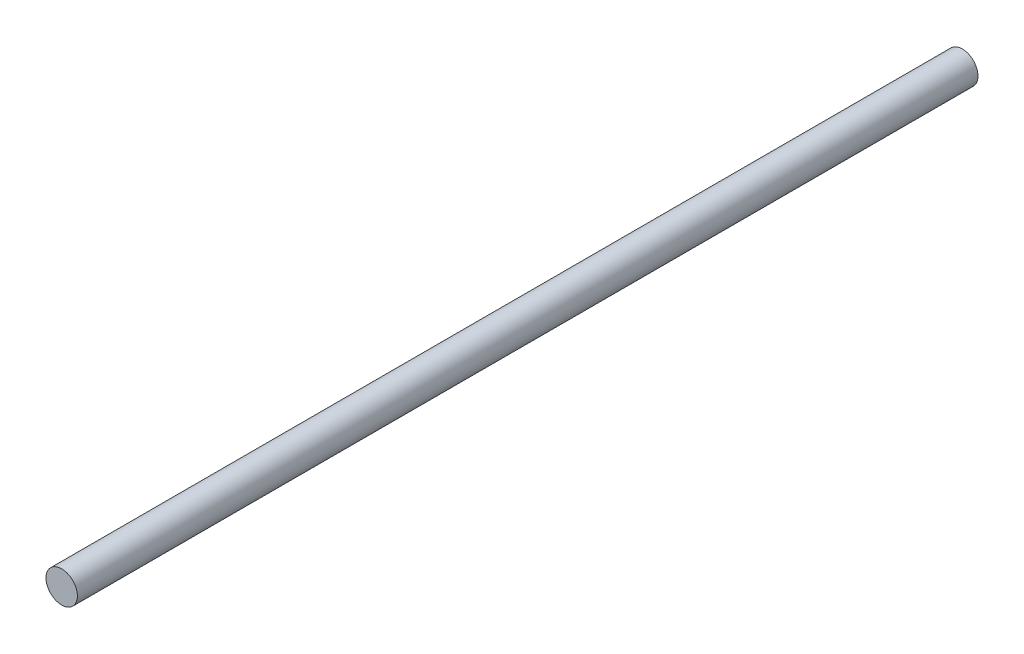
ISO-10303-21;
HEADER;
FILE_DESCRIPTION(('STEP AP214'),'2;1');
FILE_NAME('part.step','',(''),(''),'','','');
FILE_SCHEMA(('AUTOMOTIVE_DESIGN { 1 0 10303 214 1 1 1 1 }'));
ENDSEC;
DATA;
#1=APPLICATION_CONTEXT('core data for automotive mechanical design processes');
#2=APPLICATION_PROTOCOL_DEFINITION('international standard','automotive_design',2000,#1);
#3=PRODUCT_CONTEXT('',#1,'mechanical');
#4=PRODUCT('Part','Part','',(#3));
#5=PRODUCT_RELATED_PRODUCT_CATEGORY('part','',(#4));
#6=PRODUCT_DEFINITION_FORMATION('','',#4);
#7=PRODUCT_DEFINITION_CONTEXT('part definition',#1,'design');
#8=PRODUCT_DEFINITION('design','',#6,#7);
#9=PRODUCT_DEFINITION_SHAPE('','',#8);
#10=(LENGTH_UNIT() NAMED_UNIT(*) SI_UNIT(.MILLI.,.METRE.));
#11=(NAMED_UNIT(*) PLANE_ANGLE_UNIT() SI_UNIT($,.RADIAN.));
#12=(NAMED_UNIT(*) SI_UNIT($,.STERADIAN.) SOLID_ANGLE_UNIT());
#13=UNCERTAINTY_MEASURE_WITH_UNIT(LENGTH_MEASURE(1.E-05),#10,'distance_accuracy_value','');
#14=(GEOMETRIC_REPRESENTATION_CONTEXT(3) GLOBAL_UNCERTAINTY_ASSIGNED_CONTEXT((#13)) GLOBAL_UNIT_ASSIGNED_CONTEXT((#10,
#11,#12)) REPRESENTATION_CONTEXT('',''));
#15=CARTESIAN_POINT('',(0.,0.,0.));
#16=DIRECTION('',(0.,0.,1.));
#17=DIRECTION('',(1.,0.,0.));
#18=AXIS2_PLACEMENT_3D('',#15,#16,#17);
#19=CARTESIAN_POINT('',(0.,0.,91.));
#20=DIRECTION('',(0.,0.,-1.));
#21=DIRECTION('',(-1.,0.,0.));
#22=AXIS2_PLACEMENT_3D('',#19,#20,#21);
#23=CYLINDRICAL_SURFACE('',#22,3.175);
#24=CARTESIAN_POINT('',(0.,0.,91.));
#25=DIRECTION('',(0.,0.,1.));
#26=DIRECTION('',(1.,0.,0.));
#27=AXIS2_PLACEMENT_3D('',#24,#25,#26);
#28=CIRCLE('',#27,3.175);
#29=CARTESIAN_POINT('',(3.175,0.,91.));
#30=VERTEX_POINT('',#29);
#31=EDGE_CURVE('E10',#30,#30,#28,.T.);
#32=ORIENTED_EDGE('',*,*,#31,.F.);
#33=EDGE_LOOP('',(#32));
#34=FACE_BOUND('',#33,.T.);
#35=CARTESIAN_POINT('',(0.,0.,-91.));
#36=DIRECTION('',(0.,0.,1.));
#37=DIRECTION('',(1.,0.,0.));
#38=AXIS2_PLACEMENT_3D('',#35,#36,#37);
#39=CIRCLE('',#38,3.175);
#40=CARTESIAN_POINT('',(3.175,0.,-91.));
#41=VERTEX_POINT('',#40);
#42=EDGE_CURVE('E45',#41,#41,#39,.T.);
#43=ORIENTED_EDGE('',*,*,#42,.T.);
#44=EDGE_LOOP('',(#43));
#45=FACE_BOUND('',#44,.T.);
#46=ADVANCED_FACE('F39',(#34,#45),#23,.T.);
#47=CARTESIAN_POINT('',(0.,0.,91.));
#48=DIRECTION('',(0.,0.,1.));
#49=DIRECTION('',(1.,0.,0.));
#50=AXIS2_PLACEMENT_3D('',#47,#48,#49);
#51=PLANE('',#50);
#52=ORIENTED_EDGE('',*,*,#31,.T.);
#53=EDGE_LOOP('',(#52));
#54=FACE_BOUND('',#53,.T.);
#55=ADVANCED_FACE('F53',(#54),#51,.T.);
#56=CARTESIAN_POINT('',(0.,0.,-91.));
#57=DIRECTION('',(0.,0.,1.));
#58=DIRECTION('',(1.,0.,0.));
#59=AXIS2_PLACEMENT_3D('',#56,#57,#58);
#60=PLANE('',#59);
#61=ORIENTED_EDGE('',*,*,#42,.F.);
#62=EDGE_LOOP('',(#61));
#63=FACE_BOUND('',#62,.T.);
#64=ADVANCED_FACE('F55',(#63),#60,.F.);
#65=CLOSED_SHELL('',(#46,#55,#64));
#66=MANIFOLD_SOLID_BREP('B2',#65);
#67=ADVANCED_BREP_SHAPE_REPRESENTATION('',(#18,#66),#14);
#68=SHAPE_DEFINITION_REPRESENTATION(#9,#67);
ENDSEC;
END-ISO-10303-21;
